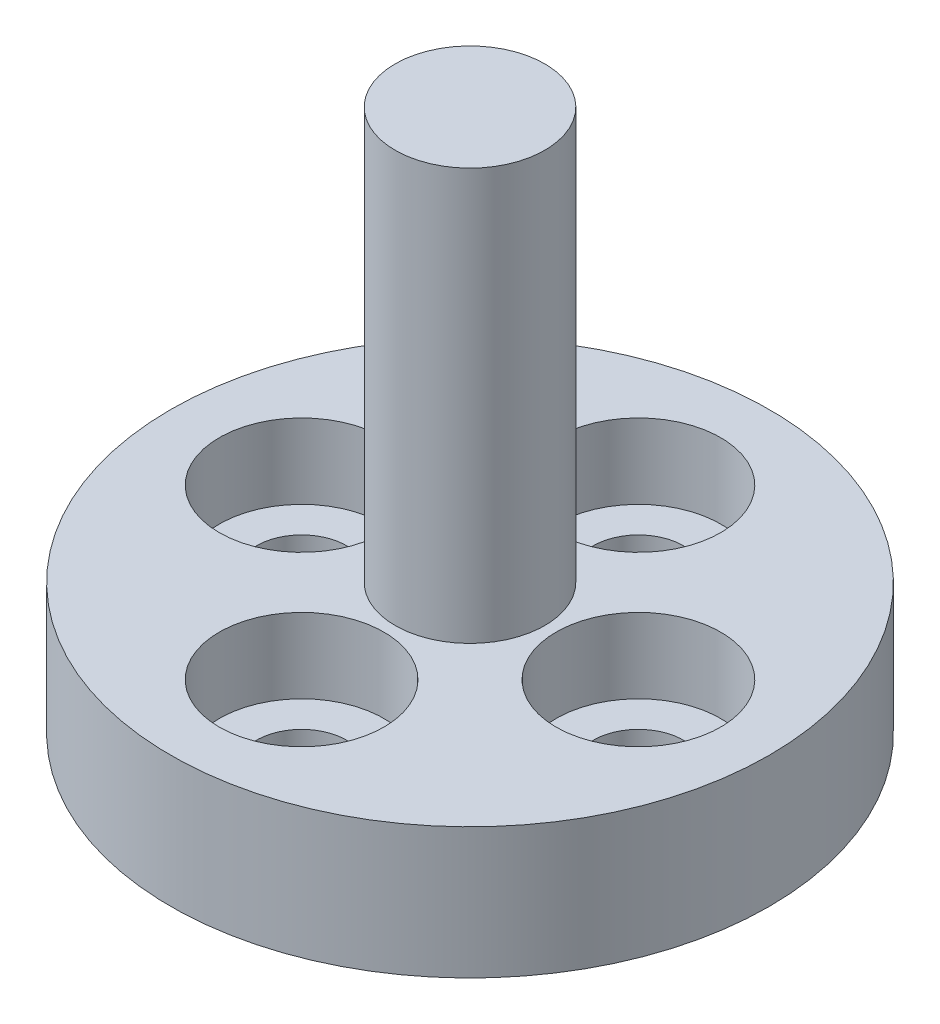
ISO-10303-21;
HEADER;
FILE_DESCRIPTION(('STEP AP214'),'2;1');
FILE_NAME('part.step','',(''),(''),'','','');
FILE_SCHEMA(('AUTOMOTIVE_DESIGN { 1 0 10303 214 1 1 1 1 }'));
ENDSEC;
DATA;
#1=APPLICATION_CONTEXT('core data for automotive mechanical design processes');
#2=APPLICATION_PROTOCOL_DEFINITION('international standard','automotive_design',2000,#1);
#3=PRODUCT_CONTEXT('',#1,'mechanical');
#4=PRODUCT('Part','Part','',(#3));
#5=PRODUCT_RELATED_PRODUCT_CATEGORY('part','',(#4));
#6=PRODUCT_DEFINITION_FORMATION('','',#4);
#7=PRODUCT_DEFINITION_CONTEXT('part definition',#1,'design');
#8=PRODUCT_DEFINITION('design','',#6,#7);
#9=PRODUCT_DEFINITION_SHAPE('','',#8);
#10=(LENGTH_UNIT() NAMED_UNIT(*) SI_UNIT(.MILLI.,.METRE.));
#11=(NAMED_UNIT(*) PLANE_ANGLE_UNIT() SI_UNIT($,.RADIAN.));
#12=(NAMED_UNIT(*) SI_UNIT($,.STERADIAN.) SOLID_ANGLE_UNIT());
#13=UNCERTAINTY_MEASURE_WITH_UNIT(LENGTH_MEASURE(1.E-05),#10,'distance_accuracy_value','');
#14=(GEOMETRIC_REPRESENTATION_CONTEXT(3) GLOBAL_UNCERTAINTY_ASSIGNED_CONTEXT((#13)) GLOBAL_UNIT_ASSIGNED_CONTEXT((#10,
#11,#12)) REPRESENTATION_CONTEXT('',''));
#15=CARTESIAN_POINT('',(0.,0.,0.));
#16=DIRECTION('',(0.,0.,1.));
#17=DIRECTION('',(1.,0.,0.));
#18=AXIS2_PLACEMENT_3D('',#15,#16,#17);
#19=CARTESIAN_POINT('',(0.,0.,0.));
#20=DIRECTION('',(0.,1.,0.));
#21=DIRECTION('',(-1.,0.,0.));
#22=AXIS2_PLACEMENT_3D('',#19,#20,#21);
#23=PLANE('',#22);
#24=CARTESIAN_POINT('',(-4.5,0.,0.));
#25=DIRECTION('',(0.,1.,0.));
#26=DIRECTION('',(0.,0.,1.));
#27=AXIS2_PLACEMENT_3D('',#24,#25,#26);
#28=CIRCLE('',#27,1.2);
#29=CARTESIAN_POINT('',(-4.5,0.,1.2));
#30=VERTEX_POINT('',#29);
#31=EDGE_CURVE('E108',#30,#30,#28,.T.);
#32=ORIENTED_EDGE('',*,*,#31,.T.);
#33=EDGE_LOOP('',(#32));
#34=FACE_BOUND('',#33,.T.);
#35=CARTESIAN_POINT('',(0.,0.,-4.5));
#36=DIRECTION('',(0.,1.,0.));
#37=DIRECTION('',(0.,0.,1.));
#38=AXIS2_PLACEMENT_3D('',#35,#36,#37);
#39=CIRCLE('',#38,1.2);
#40=CARTESIAN_POINT('',(0.,0.,-3.3));
#41=VERTEX_POINT('',#40);
#42=EDGE_CURVE('E92',#41,#41,#39,.T.);
#43=ORIENTED_EDGE('',*,*,#42,.T.);
#44=EDGE_LOOP('',(#43));
#45=FACE_BOUND('',#44,.T.);
#46=CARTESIAN_POINT('',(4.5,0.,0.));
#47=DIRECTION('',(0.,1.,0.));
#48=DIRECTION('',(0.,0.,1.));
#49=AXIS2_PLACEMENT_3D('',#46,#47,#48);
#50=CIRCLE('',#49,1.2);
#51=CARTESIAN_POINT('',(4.5,0.,1.2));
#52=VERTEX_POINT('',#51);
#53=EDGE_CURVE('E76',#52,#52,#50,.T.);
#54=ORIENTED_EDGE('',*,*,#53,.T.);
#55=EDGE_LOOP('',(#54));
#56=FACE_BOUND('',#55,.T.);
#57=CARTESIAN_POINT('',(0.,0.,4.5));
#58=DIRECTION('',(0.,1.,0.));
#59=DIRECTION('',(0.,0.,1.));
#60=AXIS2_PLACEMENT_3D('',#57,#58,#59);
#61=CIRCLE('',#60,1.2);
#62=CARTESIAN_POINT('',(0.,0.,5.7));
#63=VERTEX_POINT('',#62);
#64=EDGE_CURVE('E60',#63,#63,#61,.T.);
#65=ORIENTED_EDGE('',*,*,#64,.T.);
#66=EDGE_LOOP('',(#65));
#67=FACE_BOUND('',#66,.T.);
#68=CARTESIAN_POINT('',(0.,0.,0.));
#69=DIRECTION('',(0.,1.,0.));
#70=DIRECTION('',(-1.,0.,0.));
#71=AXIS2_PLACEMENT_3D('',#68,#69,#70);
#72=CIRCLE('',#71,8.);
#73=CARTESIAN_POINT('',(-8.,0.,0.));
#74=VERTEX_POINT('',#73);
#75=EDGE_CURVE('E10',#74,#74,#72,.T.);
#76=ORIENTED_EDGE('',*,*,#75,.F.);
#77=EDGE_LOOP('',(#76));
#78=FACE_BOUND('',#77,.T.);
#79=ADVANCED_FACE('F37',(#34,#45,#56,#67,#78),#23,.F.);
#80=CARTESIAN_POINT('',(0.,14.5,0.));
#81=DIRECTION('',(0.,1.,0.));
#82=DIRECTION('',(-1.,0.,0.));
#83=AXIS2_PLACEMENT_3D('',#80,#81,#82);
#84=CYLINDRICAL_SURFACE('',#83,8.);
#85=CARTESIAN_POINT('',(0.,3.5,0.));
#86=DIRECTION('',(0.,1.,0.));
#87=DIRECTION('',(-1.,0.,0.));
#88=AXIS2_PLACEMENT_3D('',#85,#86,#87);
#89=CIRCLE('',#88,8.);
#90=CARTESIAN_POINT('',(-8.,3.5,0.));
#91=VERTEX_POINT('',#90);
#92=EDGE_CURVE('E44',#91,#91,#89,.T.);
#93=ORIENTED_EDGE('',*,*,#92,.F.);
#94=EDGE_LOOP('',(#93));
#95=FACE_BOUND('',#94,.T.);
#96=ORIENTED_EDGE('',*,*,#75,.T.);
#97=EDGE_LOOP('',(#96));
#98=FACE_BOUND('',#97,.T.);
#99=ADVANCED_FACE('F131',(#95,#98),#84,.T.);
#100=CARTESIAN_POINT('',(8.,3.5,0.));
#101=DIRECTION('',(0.,-1.,0.));
#102=DIRECTION('',(1.,0.,0.));
#103=AXIS2_PLACEMENT_3D('',#100,#101,#102);
#104=PLANE('',#103);
#105=CARTESIAN_POINT('',(-4.5,3.5,0.));
#106=DIRECTION('',(0.,1.,0.));
#107=DIRECTION('',(0.,0.,1.));
#108=AXIS2_PLACEMENT_3D('',#105,#106,#107);
#109=CIRCLE('',#108,2.2);
#110=CARTESIAN_POINT('',(-4.5,3.5,2.2));
#111=VERTEX_POINT('',#110);
#112=EDGE_CURVE('E120',#111,#111,#109,.T.);
#113=ORIENTED_EDGE('',*,*,#112,.F.);
#114=EDGE_LOOP('',(#113));
#115=FACE_BOUND('',#114,.T.);
#116=CARTESIAN_POINT('',(0.,3.5,-4.5));
#117=DIRECTION('',(0.,1.,0.));
#118=DIRECTION('',(0.,0.,1.));
#119=AXIS2_PLACEMENT_3D('',#116,#117,#118);
#120=CIRCLE('',#119,2.2);
#121=CARTESIAN_POINT('',(0.,3.5,-2.3));
#122=VERTEX_POINT('',#121);
#123=EDGE_CURVE('E104',#122,#122,#120,.T.);
#124=ORIENTED_EDGE('',*,*,#123,.F.);
#125=EDGE_LOOP('',(#124));
#126=FACE_BOUND('',#125,.T.);
#127=CARTESIAN_POINT('',(4.5,3.5,0.));
#128=DIRECTION('',(0.,1.,0.));
#129=DIRECTION('',(0.,0.,1.));
#130=AXIS2_PLACEMENT_3D('',#127,#128,#129);
#131=CIRCLE('',#130,2.2);
#132=CARTESIAN_POINT('',(4.5,3.5,2.2));
#133=VERTEX_POINT('',#132);
#134=EDGE_CURVE('E88',#133,#133,#131,.T.);
#135=ORIENTED_EDGE('',*,*,#134,.F.);
#136=EDGE_LOOP('',(#135));
#137=FACE_BOUND('',#136,.T.);
#138=CARTESIAN_POINT('',(0.,3.5,4.5));
#139=DIRECTION('',(0.,1.,0.));
#140=DIRECTION('',(0.,0.,1.));
#141=AXIS2_PLACEMENT_3D('',#138,#139,#140);
#142=CIRCLE('',#141,2.2);
#143=CARTESIAN_POINT('',(0.,3.5,6.7));
#144=VERTEX_POINT('',#143);
#145=EDGE_CURVE('E72',#144,#144,#142,.T.);
#146=ORIENTED_EDGE('',*,*,#145,.F.);
#147=EDGE_LOOP('',(#146));
#148=FACE_BOUND('',#147,.T.);
#149=CARTESIAN_POINT('',(0.,3.5,0.));
#150=DIRECTION('',(0.,1.,0.));
#151=DIRECTION('',(-1.,0.,0.));
#152=AXIS2_PLACEMENT_3D('',#149,#150,#151);
#153=CIRCLE('',#152,2.);
#154=CARTESIAN_POINT('',(-2.,3.5,0.));
#155=VERTEX_POINT('',#154);
#156=EDGE_CURVE('E49',#155,#155,#153,.T.);
#157=ORIENTED_EDGE('',*,*,#156,.F.);
#158=EDGE_LOOP('',(#157));
#159=FACE_BOUND('',#158,.T.);
#160=ORIENTED_EDGE('',*,*,#92,.T.);
#161=EDGE_LOOP('',(#160));
#162=FACE_BOUND('',#161,.T.);
#163=ADVANCED_FACE('F127',(#115,#126,#137,#148,#159,#162),#104,.F.);
#164=CARTESIAN_POINT('',(0.,14.5,0.));
#165=DIRECTION('',(0.,1.,0.));
#166=DIRECTION('',(-1.,0.,0.));
#167=AXIS2_PLACEMENT_3D('',#164,#165,#166);
#168=CYLINDRICAL_SURFACE('',#167,2.);
#169=CARTESIAN_POINT('',(0.,14.5,0.));
#170=DIRECTION('',(0.,1.,0.));
#171=DIRECTION('',(-1.,0.,0.));
#172=AXIS2_PLACEMENT_3D('',#169,#170,#171);
#173=CIRCLE('',#172,2.);
#174=CARTESIAN_POINT('',(-2.,14.5,0.));
#175=VERTEX_POINT('',#174);
#176=EDGE_CURVE('E54',#175,#175,#173,.T.);
#177=ORIENTED_EDGE('',*,*,#176,.F.);
#178=EDGE_LOOP('',(#177));
#179=FACE_BOUND('',#178,.T.);
#180=ORIENTED_EDGE('',*,*,#156,.T.);
#181=EDGE_LOOP('',(#180));
#182=FACE_BOUND('',#181,.T.);
#183=ADVANCED_FACE('F130',(#179,#182),#168,.T.);
#184=CARTESIAN_POINT('',(2.,14.5,0.));
#185=DIRECTION('',(0.,-1.,0.));
#186=DIRECTION('',(1.,0.,0.));
#187=AXIS2_PLACEMENT_3D('',#184,#185,#186);
#188=PLANE('',#187);
#189=ORIENTED_EDGE('',*,*,#176,.T.);
#190=EDGE_LOOP('',(#189));
#191=FACE_BOUND('',#190,.T.);
#192=ADVANCED_FACE('F142',(#191),#188,.F.);
#193=CARTESIAN_POINT('',(0.,3.5,4.5));
#194=DIRECTION('',(0.,1.,0.));
#195=DIRECTION('',(0.,0.,1.));
#196=AXIS2_PLACEMENT_3D('',#193,#194,#195);
#197=CYLINDRICAL_SURFACE('',#196,1.2);
#198=ORIENTED_EDGE('',*,*,#64,.F.);
#199=EDGE_LOOP('',(#198));
#200=FACE_BOUND('',#199,.T.);
#201=CARTESIAN_POINT('',(0.,1.5,4.5));
#202=DIRECTION('',(0.,1.,0.));
#203=DIRECTION('',(0.,0.,1.));
#204=AXIS2_PLACEMENT_3D('',#201,#202,#203);
#205=CIRCLE('',#204,1.2);
#206=CARTESIAN_POINT('',(0.,1.5,5.7));
#207=VERTEX_POINT('',#206);
#208=EDGE_CURVE('E64',#207,#207,#205,.T.);
#209=ORIENTED_EDGE('',*,*,#208,.T.);
#210=EDGE_LOOP('',(#209));
#211=FACE_BOUND('',#210,.T.);
#212=ADVANCED_FACE('F148',(#200,#211),#197,.F.);
#213=CARTESIAN_POINT('',(1.2,1.5,4.5));
#214=DIRECTION('',(0.,-1.,0.));
#215=DIRECTION('',(0.,0.,-1.));
#216=AXIS2_PLACEMENT_3D('',#213,#214,#215);
#217=PLANE('',#216);
#218=ORIENTED_EDGE('',*,*,#208,.F.);
#219=EDGE_LOOP('',(#218));
#220=FACE_BOUND('',#219,.T.);
#221=CARTESIAN_POINT('',(0.,1.5,4.5));
#222=DIRECTION('',(0.,1.,0.));
#223=DIRECTION('',(0.,0.,1.));
#224=AXIS2_PLACEMENT_3D('',#221,#222,#223);
#225=CIRCLE('',#224,2.2);
#226=CARTESIAN_POINT('',(0.,1.5,6.7));
#227=VERTEX_POINT('',#226);
#228=EDGE_CURVE('E68',#227,#227,#225,.T.);
#229=ORIENTED_EDGE('',*,*,#228,.T.);
#230=EDGE_LOOP('',(#229));
#231=FACE_BOUND('',#230,.T.);
#232=ADVANCED_FACE('F169',(#220,#231),#217,.F.);
#233=CARTESIAN_POINT('',(0.,3.5,4.5));
#234=DIRECTION('',(0.,1.,0.));
#235=DIRECTION('',(0.,0.,1.));
#236=AXIS2_PLACEMENT_3D('',#233,#234,#235);
#237=CYLINDRICAL_SURFACE('',#236,2.2);
#238=ORIENTED_EDGE('',*,*,#228,.F.);
#239=EDGE_LOOP('',(#238));
#240=FACE_BOUND('',#239,.T.);
#241=ORIENTED_EDGE('',*,*,#145,.T.);
#242=EDGE_LOOP('',(#241));
#243=FACE_BOUND('',#242,.T.);
#244=ADVANCED_FACE('F175',(#240,#243),#237,.F.);
#245=CARTESIAN_POINT('',(4.5,3.5,0.));
#246=DIRECTION('',(0.,1.,0.));
#247=DIRECTION('',(0.,0.,1.));
#248=AXIS2_PLACEMENT_3D('',#245,#246,#247);
#249=CYLINDRICAL_SURFACE('',#248,1.2);
#250=ORIENTED_EDGE('',*,*,#53,.F.);
#251=EDGE_LOOP('',(#250));
#252=FACE_BOUND('',#251,.T.);
#253=CARTESIAN_POINT('',(4.5,1.5,0.));
#254=DIRECTION('',(0.,1.,0.));
#255=DIRECTION('',(0.,0.,1.));
#256=AXIS2_PLACEMENT_3D('',#253,#254,#255);
#257=CIRCLE('',#256,1.2);
#258=CARTESIAN_POINT('',(4.5,1.5,1.2));
#259=VERTEX_POINT('',#258);
#260=EDGE_CURVE('E80',#259,#259,#257,.T.);
#261=ORIENTED_EDGE('',*,*,#260,.T.);
#262=EDGE_LOOP('',(#261));
#263=FACE_BOUND('',#262,.T.);
#264=ADVANCED_FACE('F181',(#252,#263),#249,.F.);
#265=CARTESIAN_POINT('',(5.7,1.5,0.));
#266=DIRECTION('',(0.,-1.,0.));
#267=DIRECTION('',(0.,0.,-1.));
#268=AXIS2_PLACEMENT_3D('',#265,#266,#267);
#269=PLANE('',#268);
#270=ORIENTED_EDGE('',*,*,#260,.F.);
#271=EDGE_LOOP('',(#270));
#272=FACE_BOUND('',#271,.T.);
#273=CARTESIAN_POINT('',(4.5,1.5,0.));
#274=DIRECTION('',(0.,1.,0.));
#275=DIRECTION('',(0.,0.,1.));
#276=AXIS2_PLACEMENT_3D('',#273,#274,#275);
#277=CIRCLE('',#276,2.2);
#278=CARTESIAN_POINT('',(4.5,1.5,2.2));
#279=VERTEX_POINT('',#278);
#280=EDGE_CURVE('E84',#279,#279,#277,.T.);
#281=ORIENTED_EDGE('',*,*,#280,.T.);
#282=EDGE_LOOP('',(#281));
#283=FACE_BOUND('',#282,.T.);
#284=ADVANCED_FACE('F186',(#272,#283),#269,.F.);
#285=CARTESIAN_POINT('',(4.5,3.5,0.));
#286=DIRECTION('',(0.,1.,0.));
#287=DIRECTION('',(0.,0.,1.));
#288=AXIS2_PLACEMENT_3D('',#285,#286,#287);
#289=CYLINDRICAL_SURFACE('',#288,2.2);
#290=ORIENTED_EDGE('',*,*,#280,.F.);
#291=EDGE_LOOP('',(#290));
#292=FACE_BOUND('',#291,.T.);
#293=ORIENTED_EDGE('',*,*,#134,.T.);
#294=EDGE_LOOP('',(#293));
#295=FACE_BOUND('',#294,.T.);
#296=ADVANCED_FACE('F192',(#292,#295),#289,.F.);
#297=CARTESIAN_POINT('',(0.,3.5,-4.5));
#298=DIRECTION('',(0.,1.,0.));
#299=DIRECTION('',(0.,0.,1.));
#300=AXIS2_PLACEMENT_3D('',#297,#298,#299);
#301=CYLINDRICAL_SURFACE('',#300,1.2);
#302=ORIENTED_EDGE('',*,*,#42,.F.);
#303=EDGE_LOOP('',(#302));
#304=FACE_BOUND('',#303,.T.);
#305=CARTESIAN_POINT('',(0.,1.5,-4.5));
#306=DIRECTION('',(0.,1.,0.));
#307=DIRECTION('',(0.,0.,1.));
#308=AXIS2_PLACEMENT_3D('',#305,#306,#307);
#309=CIRCLE('',#308,1.2);
#310=CARTESIAN_POINT('',(0.,1.5,-3.3));
#311=VERTEX_POINT('',#310);
#312=EDGE_CURVE('E96',#311,#311,#309,.T.);
#313=ORIENTED_EDGE('',*,*,#312,.T.);
#314=EDGE_LOOP('',(#313));
#315=FACE_BOUND('',#314,.T.);
#316=ADVANCED_FACE('F196',(#304,#315),#301,.F.);
#317=CARTESIAN_POINT('',(1.2,1.5,-4.5));
#318=DIRECTION('',(0.,-1.,0.));
#319=DIRECTION('',(0.,0.,-1.));
#320=AXIS2_PLACEMENT_3D('',#317,#318,#319);
#321=PLANE('',#320);
#322=ORIENTED_EDGE('',*,*,#312,.F.);
#323=EDGE_LOOP('',(#322));
#324=FACE_BOUND('',#323,.T.);
#325=CARTESIAN_POINT('',(0.,1.5,-4.5));
#326=DIRECTION('',(0.,1.,0.));
#327=DIRECTION('',(0.,0.,1.));
#328=AXIS2_PLACEMENT_3D('',#325,#326,#327);
#329=CIRCLE('',#328,2.2);
#330=CARTESIAN_POINT('',(0.,1.5,-2.3));
#331=VERTEX_POINT('',#330);
#332=EDGE_CURVE('E100',#331,#331,#329,.T.);
#333=ORIENTED_EDGE('',*,*,#332,.T.);
#334=EDGE_LOOP('',(#333));
#335=FACE_BOUND('',#334,.T.);
#336=ADVANCED_FACE('F200',(#324,#335),#321,.F.);
#337=CARTESIAN_POINT('',(0.,3.5,-4.5));
#338=DIRECTION('',(0.,1.,0.));
#339=DIRECTION('',(0.,0.,1.));
#340=AXIS2_PLACEMENT_3D('',#337,#338,#339);
#341=CYLINDRICAL_SURFACE('',#340,2.2);
#342=ORIENTED_EDGE('',*,*,#332,.F.);
#343=EDGE_LOOP('',(#342));
#344=FACE_BOUND('',#343,.T.);
#345=ORIENTED_EDGE('',*,*,#123,.T.);
#346=EDGE_LOOP('',(#345));
#347=FACE_BOUND('',#346,.T.);
#348=ADVANCED_FACE('F204',(#344,#347),#341,.F.);
#349=CARTESIAN_POINT('',(-4.5,3.5,0.));
#350=DIRECTION('',(0.,1.,0.));
#351=DIRECTION('',(0.,0.,1.));
#352=AXIS2_PLACEMENT_3D('',#349,#350,#351);
#353=CYLINDRICAL_SURFACE('',#352,1.2);
#354=ORIENTED_EDGE('',*,*,#31,.F.);
#355=EDGE_LOOP('',(#354));
#356=FACE_BOUND('',#355,.T.);
#357=CARTESIAN_POINT('',(-4.5,1.5,0.));
#358=DIRECTION('',(0.,1.,0.));
#359=DIRECTION('',(0.,0.,1.));
#360=AXIS2_PLACEMENT_3D('',#357,#358,#359);
#361=CIRCLE('',#360,1.2);
#362=CARTESIAN_POINT('',(-4.5,1.5,1.2));
#363=VERTEX_POINT('',#362);
#364=EDGE_CURVE('E112',#363,#363,#361,.T.);
#365=ORIENTED_EDGE('',*,*,#364,.T.);
#366=EDGE_LOOP('',(#365));
#367=FACE_BOUND('',#366,.T.);
#368=ADVANCED_FACE('F208',(#356,#367),#353,.F.);
#369=CARTESIAN_POINT('',(-3.3,1.5,0.));
#370=DIRECTION('',(0.,-1.,0.));
#371=DIRECTION('',(0.,0.,-1.));
#372=AXIS2_PLACEMENT_3D('',#369,#370,#371);
#373=PLANE('',#372);
#374=ORIENTED_EDGE('',*,*,#364,.F.);
#375=EDGE_LOOP('',(#374));
#376=FACE_BOUND('',#375,.T.);
#377=CARTESIAN_POINT('',(-4.5,1.5,0.));
#378=DIRECTION('',(0.,1.,0.));
#379=DIRECTION('',(0.,0.,1.));
#380=AXIS2_PLACEMENT_3D('',#377,#378,#379);
#381=CIRCLE('',#380,2.2);
#382=CARTESIAN_POINT('',(-4.5,1.5,2.2));
#383=VERTEX_POINT('',#382);
#384=EDGE_CURVE('E116',#383,#383,#381,.T.);
#385=ORIENTED_EDGE('',*,*,#384,.T.);
#386=EDGE_LOOP('',(#385));
#387=FACE_BOUND('',#386,.T.);
#388=ADVANCED_FACE('F212',(#376,#387),#373,.F.);
#389=CARTESIAN_POINT('',(-4.5,3.5,0.));
#390=DIRECTION('',(0.,1.,0.));
#391=DIRECTION('',(0.,0.,1.));
#392=AXIS2_PLACEMENT_3D('',#389,#390,#391);
#393=CYLINDRICAL_SURFACE('',#392,2.2);
#394=ORIENTED_EDGE('',*,*,#384,.F.);
#395=EDGE_LOOP('',(#394));
#396=FACE_BOUND('',#395,.T.);
#397=ORIENTED_EDGE('',*,*,#112,.T.);
#398=EDGE_LOOP('',(#397));
#399=FACE_BOUND('',#398,.T.);
#400=ADVANCED_FACE('F125',(#396,#399),#393,.F.);
#401=CLOSED_SHELL('',(#79,#99,#163,#183,#192,#212,#232,#244,#264,#284,#296,#316,#336,#348,#368,
#388,#400));
#402=MANIFOLD_SOLID_BREP('B2',#401);
#403=ADVANCED_BREP_SHAPE_REPRESENTATION('',(#18,#402),#14);
#404=SHAPE_DEFINITION_REPRESENTATION(#9,#403);
ENDSEC;
END-ISO-10303-21;
